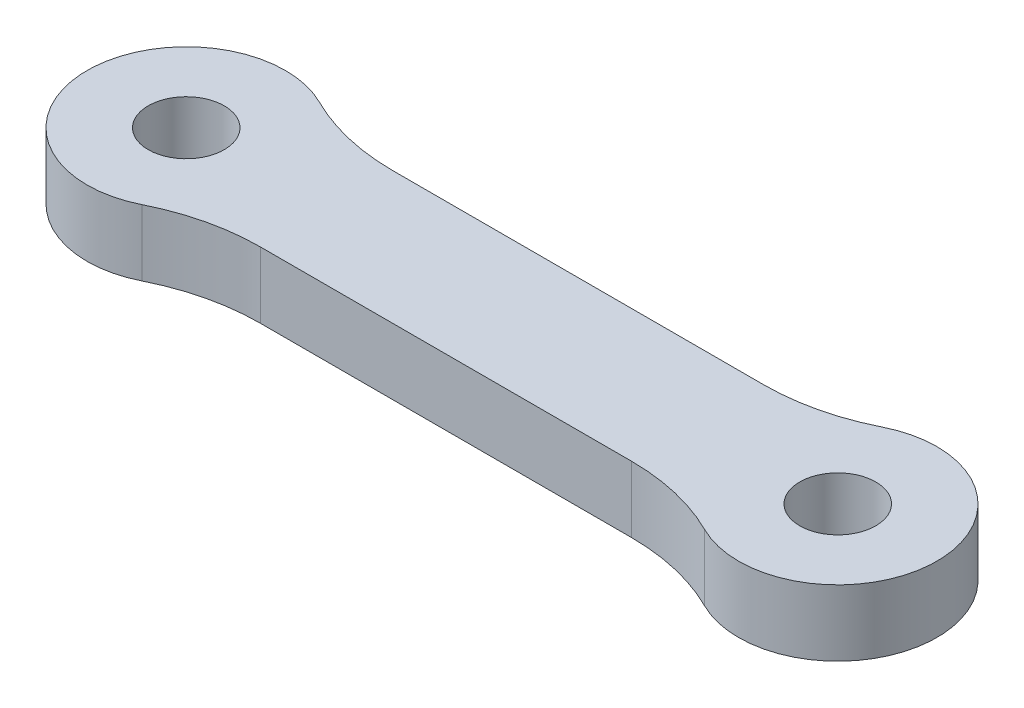
ISO-10303-21;
HEADER;
FILE_DESCRIPTION(('STEP AP214'),'2;1');
FILE_NAME('part.step','',(''),(''),'','','');
FILE_SCHEMA(('AUTOMOTIVE_DESIGN { 1 0 10303 214 1 1 1 1 }'));
ENDSEC;
DATA;
#1=APPLICATION_CONTEXT('core data for automotive mechanical design processes');
#2=APPLICATION_PROTOCOL_DEFINITION('international standard','automotive_design',2000,#1);
#3=PRODUCT_CONTEXT('',#1,'mechanical');
#4=PRODUCT('Part','Part','',(#3));
#5=PRODUCT_RELATED_PRODUCT_CATEGORY('part','',(#4));
#6=PRODUCT_DEFINITION_FORMATION('','',#4);
#7=PRODUCT_DEFINITION_CONTEXT('part definition',#1,'design');
#8=PRODUCT_DEFINITION('design','',#6,#7);
#9=PRODUCT_DEFINITION_SHAPE('','',#8);
#10=(LENGTH_UNIT() NAMED_UNIT(*) SI_UNIT(.MILLI.,.METRE.));
#11=(NAMED_UNIT(*) PLANE_ANGLE_UNIT() SI_UNIT($,.RADIAN.));
#12=(NAMED_UNIT(*) SI_UNIT($,.STERADIAN.) SOLID_ANGLE_UNIT());
#13=UNCERTAINTY_MEASURE_WITH_UNIT(LENGTH_MEASURE(1.E-05),#10,'distance_accuracy_value','');
#14=(GEOMETRIC_REPRESENTATION_CONTEXT(3) GLOBAL_UNCERTAINTY_ASSIGNED_CONTEXT((#13)) GLOBAL_UNIT_ASSIGNED_CONTEXT((#10,
#11,#12)) REPRESENTATION_CONTEXT('',''));
#15=CARTESIAN_POINT('',(0.,0.,0.));
#16=DIRECTION('',(0.,0.,1.));
#17=DIRECTION('',(1.,0.,0.));
#18=AXIS2_PLACEMENT_3D('',#15,#16,#17);
#19=CARTESIAN_POINT('',(0.,2.,2.));
#20=DIRECTION('',(0.,0.,1.));
#21=DIRECTION('',(1.,0.,0.));
#22=AXIS2_PLACEMENT_3D('',#19,#20,#21);
#23=PLANE('',#22);
#24=DIRECTION('',(-1.,0.,0.));
#25=VECTOR('',#24,1.);
#26=CARTESIAN_POINT('',(0.,0.,2.));
#27=LINE('',#26,#25);
#28=CARTESIAN_POINT('',(15.4573593128807,0.,2.));
#29=VERTEX_POINT('',#28);
#30=CARTESIAN_POINT('',(4.24264068711928,0.,2.));
#31=VERTEX_POINT('',#30);
#32=EDGE_CURVE('E171',#29,#31,#27,.T.);
#33=ORIENTED_EDGE('',*,*,#32,.F.);
#34=DIRECTION('',(0.,-1.,0.));
#35=VECTOR('',#34,1.);
#36=CARTESIAN_POINT('',(15.4573593128807,2.,2.));
#37=LINE('',#36,#35);
#38=CARTESIAN_POINT('',(15.4573593128807,2.,2.));
#39=VERTEX_POINT('',#38);
#40=EDGE_CURVE('E140',#29,#39,#37,.F.);
#41=ORIENTED_EDGE('',*,*,#40,.T.);
#42=DIRECTION('',(-1.,0.,0.));
#43=VECTOR('',#42,1.);
#44=CARTESIAN_POINT('',(0.,2.,2.));
#45=LINE('',#44,#43);
#46=CARTESIAN_POINT('',(4.24264068711928,2.,2.));
#47=VERTEX_POINT('',#46);
#48=EDGE_CURVE('E159',#39,#47,#45,.T.);
#49=ORIENTED_EDGE('',*,*,#48,.T.);
#50=DIRECTION('',(0.,-1.,0.));
#51=VECTOR('',#50,1.);
#52=CARTESIAN_POINT('',(4.24264068711928,2.,2.));
#53=LINE('',#52,#51);
#54=EDGE_CURVE('E137',#47,#31,#53,.T.);
#55=ORIENTED_EDGE('',*,*,#54,.T.);
#56=EDGE_LOOP('',(#33,#41,#49,#55));
#57=FACE_BOUND('',#56,.T.);
#58=ADVANCED_FACE('F41',(#57),#23,.T.);
#59=CARTESIAN_POINT('',(19.7,2.,0.));
#60=DIRECTION('',(0.,-1.,0.));
#61=DIRECTION('',(0.,0.,-1.));
#62=AXIS2_PLACEMENT_3D('',#59,#60,#61);
#63=CYLINDRICAL_SURFACE('',#62,3.);
#64=CARTESIAN_POINT('',(19.7,0.,0.));
#65=DIRECTION('',(0.,1.,0.));
#66=DIRECTION('',(0.,0.,1.));
#67=AXIS2_PLACEMENT_3D('',#64,#65,#66);
#68=CIRCLE('',#67,3.);
#69=CARTESIAN_POINT('',(18.3602187303834,0.,2.68421052631579));
#70=VERTEX_POINT('',#69);
#71=CARTESIAN_POINT('',(18.3602187303834,0.,-2.68421052631579));
#72=VERTEX_POINT('',#71);
#73=EDGE_CURVE('E123',#70,#72,#68,.T.);
#74=ORIENTED_EDGE('',*,*,#73,.T.);
#75=DIRECTION('',(0.,-1.,0.));
#76=VECTOR('',#75,1.);
#77=CARTESIAN_POINT('',(18.3602187303834,2.,-2.68421052631579));
#78=LINE('',#77,#76);
#79=CARTESIAN_POINT('',(18.3602187303834,2.,-2.68421052631579));
#80=VERTEX_POINT('',#79);
#81=EDGE_CURVE('E135',#72,#80,#78,.F.);
#82=ORIENTED_EDGE('',*,*,#81,.T.);
#83=CARTESIAN_POINT('',(19.7,2.,0.));
#84=DIRECTION('',(0.,1.,0.));
#85=DIRECTION('',(0.,0.,1.));
#86=AXIS2_PLACEMENT_3D('',#83,#84,#85);
#87=CIRCLE('',#86,3.);
#88=CARTESIAN_POINT('',(18.3602187303834,2.,2.68421052631579));
#89=VERTEX_POINT('',#88);
#90=EDGE_CURVE('E167',#89,#80,#87,.T.);
#91=ORIENTED_EDGE('',*,*,#90,.F.);
#92=DIRECTION('',(0.,-1.,0.));
#93=VECTOR('',#92,1.);
#94=CARTESIAN_POINT('',(18.3602187303834,2.,2.68421052631579));
#95=LINE('',#94,#93);
#96=EDGE_CURVE('E127',#89,#70,#95,.T.);
#97=ORIENTED_EDGE('',*,*,#96,.T.);
#98=EDGE_LOOP('',(#74,#82,#91,#97));
#99=FACE_BOUND('',#98,.T.);
#100=ADVANCED_FACE('F194',(#99),#63,.T.);
#101=CARTESIAN_POINT('',(0.,2.,-2.));
#102=DIRECTION('',(0.,0.,-1.));
#103=DIRECTION('',(-1.,0.,0.));
#104=AXIS2_PLACEMENT_3D('',#101,#102,#103);
#105=PLANE('',#104);
#106=DIRECTION('',(1.,0.,0.));
#107=VECTOR('',#106,1.);
#108=CARTESIAN_POINT('',(0.,2.,-2.));
#109=LINE('',#108,#107);
#110=CARTESIAN_POINT('',(4.24264068711928,2.,-2.));
#111=VERTEX_POINT('',#110);
#112=CARTESIAN_POINT('',(15.4573593128807,2.,-2.));
#113=VERTEX_POINT('',#112);
#114=EDGE_CURVE('E129',#111,#113,#109,.T.);
#115=ORIENTED_EDGE('',*,*,#114,.T.);
#116=DIRECTION('',(0.,-1.,0.));
#117=VECTOR('',#116,1.);
#118=CARTESIAN_POINT('',(15.4573593128807,2.,-2.));
#119=LINE('',#118,#117);
#120=CARTESIAN_POINT('',(15.4573593128807,0.,-2.));
#121=VERTEX_POINT('',#120);
#122=EDGE_CURVE('E122',#113,#121,#119,.T.);
#123=ORIENTED_EDGE('',*,*,#122,.T.);
#124=DIRECTION('',(1.,0.,0.));
#125=VECTOR('',#124,1.);
#126=CARTESIAN_POINT('',(0.,0.,-2.));
#127=LINE('',#126,#125);
#128=CARTESIAN_POINT('',(4.24264068711928,0.,-2.));
#129=VERTEX_POINT('',#128);
#130=EDGE_CURVE('E109',#129,#121,#127,.T.);
#131=ORIENTED_EDGE('',*,*,#130,.F.);
#132=DIRECTION('',(0.,-1.,0.));
#133=VECTOR('',#132,1.);
#134=CARTESIAN_POINT('',(4.24264068711928,2.,-2.));
#135=LINE('',#134,#133);
#136=EDGE_CURVE('E120',#129,#111,#135,.F.);
#137=ORIENTED_EDGE('',*,*,#136,.T.);
#138=EDGE_LOOP('',(#115,#123,#131,#137));
#139=FACE_BOUND('',#138,.T.);
#140=ADVANCED_FACE('F119',(#139),#105,.T.);
#141=CARTESIAN_POINT('',(0.,2.,0.));
#142=DIRECTION('',(0.,-1.,0.));
#143=DIRECTION('',(0.,0.,-1.));
#144=AXIS2_PLACEMENT_3D('',#141,#142,#143);
#145=CYLINDRICAL_SURFACE('',#144,1.15);
#146=CARTESIAN_POINT('',(0.,2.,0.));
#147=DIRECTION('',(0.,1.,0.));
#148=DIRECTION('',(0.,0.,1.));
#149=AXIS2_PLACEMENT_3D('',#146,#147,#148);
#150=CIRCLE('',#149,1.15);
#151=CARTESIAN_POINT('',(0.,2.,1.15));
#152=VERTEX_POINT('',#151);
#153=EDGE_CURVE('E168',#152,#152,#150,.T.);
#154=ORIENTED_EDGE('',*,*,#153,.T.);
#155=EDGE_LOOP('',(#154));
#156=FACE_BOUND('',#155,.T.);
#157=CARTESIAN_POINT('',(0.,0.,0.));
#158=DIRECTION('',(0.,1.,0.));
#159=DIRECTION('',(0.,0.,1.));
#160=AXIS2_PLACEMENT_3D('',#157,#158,#159);
#161=CIRCLE('',#160,1.15);
#162=CARTESIAN_POINT('',(0.,0.,1.15));
#163=VERTEX_POINT('',#162);
#164=EDGE_CURVE('E187',#163,#163,#161,.T.);
#165=ORIENTED_EDGE('',*,*,#164,.F.);
#166=EDGE_LOOP('',(#165));
#167=FACE_BOUND('',#166,.T.);
#168=ADVANCED_FACE('F218',(#156,#167),#145,.F.);
#169=CARTESIAN_POINT('',(19.7,2.,0.));
#170=DIRECTION('',(0.,-1.,0.));
#171=DIRECTION('',(0.,0.,-1.));
#172=AXIS2_PLACEMENT_3D('',#169,#170,#171);
#173=CYLINDRICAL_SURFACE('',#172,1.15);
#174=CARTESIAN_POINT('',(19.7,2.,0.));
#175=DIRECTION('',(0.,1.,0.));
#176=DIRECTION('',(0.,0.,1.));
#177=AXIS2_PLACEMENT_3D('',#174,#175,#176);
#178=CIRCLE('',#177,1.15);
#179=CARTESIAN_POINT('',(19.7,2.,1.15));
#180=VERTEX_POINT('',#179);
#181=EDGE_CURVE('E173',#180,#180,#178,.T.);
#182=ORIENTED_EDGE('',*,*,#181,.T.);
#183=EDGE_LOOP('',(#182));
#184=FACE_BOUND('',#183,.T.);
#185=CARTESIAN_POINT('',(19.7,0.,0.));
#186=DIRECTION('',(0.,1.,0.));
#187=DIRECTION('',(0.,0.,1.));
#188=AXIS2_PLACEMENT_3D('',#185,#186,#187);
#189=CIRCLE('',#188,1.15);
#190=CARTESIAN_POINT('',(19.7,0.,1.15));
#191=VERTEX_POINT('',#190);
#192=EDGE_CURVE('E184',#191,#191,#189,.T.);
#193=ORIENTED_EDGE('',*,*,#192,.F.);
#194=EDGE_LOOP('',(#193));
#195=FACE_BOUND('',#194,.T.);
#196=ADVANCED_FACE('F221',(#184,#195),#173,.F.);
#197=CARTESIAN_POINT('',(0.,2.,0.));
#198=DIRECTION('',(0.,-1.,0.));
#199=DIRECTION('',(0.,0.,-1.));
#200=AXIS2_PLACEMENT_3D('',#197,#198,#199);
#201=CYLINDRICAL_SURFACE('',#200,3.);
#202=CARTESIAN_POINT('',(0.,0.,0.));
#203=DIRECTION('',(0.,1.,0.));
#204=DIRECTION('',(0.,0.,1.));
#205=AXIS2_PLACEMENT_3D('',#202,#203,#204);
#206=CIRCLE('',#205,3.);
#207=CARTESIAN_POINT('',(1.33978126961662,0.,-2.68421052631579));
#208=VERTEX_POINT('',#207);
#209=CARTESIAN_POINT('',(1.33978126961661,0.,2.68421052631579));
#210=VERTEX_POINT('',#209);
#211=EDGE_CURVE('E110',#208,#210,#206,.T.);
#212=ORIENTED_EDGE('',*,*,#211,.T.);
#213=DIRECTION('',(0.,-1.,0.));
#214=VECTOR('',#213,1.);
#215=CARTESIAN_POINT('',(1.33978126961661,2.,2.68421052631579));
#216=LINE('',#215,#214);
#217=CARTESIAN_POINT('',(1.33978126961661,2.,2.68421052631579));
#218=VERTEX_POINT('',#217);
#219=EDGE_CURVE('E56',#210,#218,#216,.F.);
#220=ORIENTED_EDGE('',*,*,#219,.T.);
#221=CARTESIAN_POINT('',(0.,2.,0.));
#222=DIRECTION('',(0.,1.,0.));
#223=DIRECTION('',(0.,0.,1.));
#224=AXIS2_PLACEMENT_3D('',#221,#222,#223);
#225=CIRCLE('',#224,3.);
#226=CARTESIAN_POINT('',(1.33978126961662,2.,-2.68421052631579));
#227=VERTEX_POINT('',#226);
#228=EDGE_CURVE('E125',#227,#218,#225,.T.);
#229=ORIENTED_EDGE('',*,*,#228,.F.);
#230=DIRECTION('',(0.,-1.,0.));
#231=VECTOR('',#230,1.);
#232=CARTESIAN_POINT('',(1.33978126961662,2.,-2.68421052631579));
#233=LINE('',#232,#231);
#234=EDGE_CURVE('E142',#227,#208,#233,.T.);
#235=ORIENTED_EDGE('',*,*,#234,.T.);
#236=EDGE_LOOP('',(#212,#220,#229,#235));
#237=FACE_BOUND('',#236,.T.);
#238=ADVANCED_FACE('F172',(#237),#201,.T.);
#239=CARTESIAN_POINT('',(0.,2.,0.));
#240=DIRECTION('',(0.,1.,0.));
#241=DIRECTION('',(0.,0.,1.));
#242=AXIS2_PLACEMENT_3D('',#239,#240,#241);
#243=PLANE('',#242);
#244=ORIENTED_EDGE('',*,*,#181,.F.);
#245=EDGE_LOOP('',(#244));
#246=FACE_BOUND('',#245,.T.);
#247=ORIENTED_EDGE('',*,*,#153,.F.);
#248=EDGE_LOOP('',(#247));
#249=FACE_BOUND('',#248,.T.);
#250=ORIENTED_EDGE('',*,*,#48,.F.);
#251=CARTESIAN_POINT('',(15.4573593128807,2.,8.5));
#252=DIRECTION('',(0.,1.,0.));
#253=DIRECTION('',(0.,0.,1.));
#254=AXIS2_PLACEMENT_3D('',#251,#252,#253);
#255=CIRCLE('',#254,6.5);
#256=EDGE_CURVE('E151',#39,#89,#255,.F.);
#257=ORIENTED_EDGE('',*,*,#256,.T.);
#258=ORIENTED_EDGE('',*,*,#90,.T.);
#259=CARTESIAN_POINT('',(15.4573593128807,2.,-8.5));
#260=DIRECTION('',(0.,1.,0.));
#261=DIRECTION('',(0.,0.,1.));
#262=AXIS2_PLACEMENT_3D('',#259,#260,#261);
#263=CIRCLE('',#262,6.5);
#264=EDGE_CURVE('E147',#80,#113,#263,.F.);
#265=ORIENTED_EDGE('',*,*,#264,.T.);
#266=ORIENTED_EDGE('',*,*,#114,.F.);
#267=CARTESIAN_POINT('',(4.24264068711928,2.,-8.5));
#268=DIRECTION('',(0.,1.,0.));
#269=DIRECTION('',(0.,0.,1.));
#270=AXIS2_PLACEMENT_3D('',#267,#268,#269);
#271=CIRCLE('',#270,6.5);
#272=EDGE_CURVE('E11',#111,#227,#271,.F.);
#273=ORIENTED_EDGE('',*,*,#272,.T.);
#274=ORIENTED_EDGE('',*,*,#228,.T.);
#275=CARTESIAN_POINT('',(4.24264068711928,2.,8.5));
#276=DIRECTION('',(0.,1.,0.));
#277=DIRECTION('',(0.,0.,1.));
#278=AXIS2_PLACEMENT_3D('',#275,#276,#277);
#279=CIRCLE('',#278,6.5);
#280=EDGE_CURVE('E115',#218,#47,#279,.F.);
#281=ORIENTED_EDGE('',*,*,#280,.T.);
#282=EDGE_LOOP('',(#250,#257,#258,#265,#266,#273,#274,#281));
#283=FACE_BOUND('',#282,.T.);
#284=ADVANCED_FACE('F158',(#246,#249,#283),#243,.T.);
#285=CARTESIAN_POINT('',(0.,0.,0.));
#286=DIRECTION('',(0.,1.,0.));
#287=DIRECTION('',(0.,0.,1.));
#288=AXIS2_PLACEMENT_3D('',#285,#286,#287);
#289=PLANE('',#288);
#290=ORIENTED_EDGE('',*,*,#192,.T.);
#291=EDGE_LOOP('',(#290));
#292=FACE_BOUND('',#291,.T.);
#293=ORIENTED_EDGE('',*,*,#164,.T.);
#294=EDGE_LOOP('',(#293));
#295=FACE_BOUND('',#294,.T.);
#296=ORIENTED_EDGE('',*,*,#73,.F.);
#297=CARTESIAN_POINT('',(15.4573593128807,0.,8.5));
#298=DIRECTION('',(0.,1.,0.));
#299=DIRECTION('',(0.,0.,1.));
#300=AXIS2_PLACEMENT_3D('',#297,#298,#299);
#301=CIRCLE('',#300,6.5);
#302=EDGE_CURVE('E149',#70,#29,#301,.T.);
#303=ORIENTED_EDGE('',*,*,#302,.T.);
#304=ORIENTED_EDGE('',*,*,#32,.T.);
#305=CARTESIAN_POINT('',(4.24264068711928,0.,8.5));
#306=DIRECTION('',(0.,1.,0.));
#307=DIRECTION('',(0.,0.,1.));
#308=AXIS2_PLACEMENT_3D('',#305,#306,#307);
#309=CIRCLE('',#308,6.5);
#310=EDGE_CURVE('E153',#31,#210,#309,.T.);
#311=ORIENTED_EDGE('',*,*,#310,.T.);
#312=ORIENTED_EDGE('',*,*,#211,.F.);
#313=CARTESIAN_POINT('',(4.24264068711928,0.,-8.5));
#314=DIRECTION('',(0.,1.,0.));
#315=DIRECTION('',(0.,0.,1.));
#316=AXIS2_PLACEMENT_3D('',#313,#314,#315);
#317=CIRCLE('',#316,6.5);
#318=EDGE_CURVE('E49',#208,#129,#317,.T.);
#319=ORIENTED_EDGE('',*,*,#318,.T.);
#320=ORIENTED_EDGE('',*,*,#130,.T.);
#321=CARTESIAN_POINT('',(15.4573593128807,0.,-8.5));
#322=DIRECTION('',(0.,1.,0.));
#323=DIRECTION('',(0.,0.,1.));
#324=AXIS2_PLACEMENT_3D('',#321,#322,#323);
#325=CIRCLE('',#324,6.5);
#326=EDGE_CURVE('E145',#121,#72,#325,.T.);
#327=ORIENTED_EDGE('',*,*,#326,.T.);
#328=EDGE_LOOP('',(#296,#303,#304,#311,#312,#319,#320,#327));
#329=FACE_BOUND('',#328,.T.);
#330=ADVANCED_FACE('F108',(#292,#295,#329),#289,.F.);
#331=CARTESIAN_POINT('',(15.4573593128807,2.,-8.5));
#332=DIRECTION('',(0.,-1.,0.));
#333=DIRECTION('',(0.,0.,-1.));
#334=AXIS2_PLACEMENT_3D('',#331,#332,#333);
#335=CYLINDRICAL_SURFACE('',#334,6.5);
#336=ORIENTED_EDGE('',*,*,#264,.F.);
#337=ORIENTED_EDGE('',*,*,#81,.F.);
#338=ORIENTED_EDGE('',*,*,#326,.F.);
#339=ORIENTED_EDGE('',*,*,#122,.F.);
#340=EDGE_LOOP('',(#336,#337,#338,#339));
#341=FACE_BOUND('',#340,.T.);
#342=ADVANCED_FACE('F199',(#341),#335,.F.);
#343=CARTESIAN_POINT('',(15.4573593128807,2.,8.5));
#344=DIRECTION('',(0.,-1.,0.));
#345=DIRECTION('',(0.,0.,-1.));
#346=AXIS2_PLACEMENT_3D('',#343,#344,#345);
#347=CYLINDRICAL_SURFACE('',#346,6.5);
#348=ORIENTED_EDGE('',*,*,#256,.F.);
#349=ORIENTED_EDGE('',*,*,#40,.F.);
#350=ORIENTED_EDGE('',*,*,#302,.F.);
#351=ORIENTED_EDGE('',*,*,#96,.F.);
#352=EDGE_LOOP('',(#348,#349,#350,#351));
#353=FACE_BOUND('',#352,.T.);
#354=ADVANCED_FACE('F201',(#353),#347,.F.);
#355=CARTESIAN_POINT('',(4.24264068711928,2.,8.5));
#356=DIRECTION('',(0.,-1.,0.));
#357=DIRECTION('',(0.,0.,-1.));
#358=AXIS2_PLACEMENT_3D('',#355,#356,#357);
#359=CYLINDRICAL_SURFACE('',#358,6.5);
#360=ORIENTED_EDGE('',*,*,#280,.F.);
#361=ORIENTED_EDGE('',*,*,#219,.F.);
#362=ORIENTED_EDGE('',*,*,#310,.F.);
#363=ORIENTED_EDGE('',*,*,#54,.F.);
#364=EDGE_LOOP('',(#360,#361,#362,#363));
#365=FACE_BOUND('',#364,.T.);
#366=ADVANCED_FACE('F170',(#365),#359,.F.);
#367=CARTESIAN_POINT('',(4.24264068711928,2.,-8.5));
#368=DIRECTION('',(0.,-1.,0.));
#369=DIRECTION('',(0.,0.,-1.));
#370=AXIS2_PLACEMENT_3D('',#367,#368,#369);
#371=CYLINDRICAL_SURFACE('',#370,6.5);
#372=ORIENTED_EDGE('',*,*,#272,.F.);
#373=ORIENTED_EDGE('',*,*,#136,.F.);
#374=ORIENTED_EDGE('',*,*,#318,.F.);
#375=ORIENTED_EDGE('',*,*,#234,.F.);
#376=EDGE_LOOP('',(#372,#373,#374,#375));
#377=FACE_BOUND('',#376,.T.);
#378=ADVANCED_FACE('F43',(#377),#371,.F.);
#379=CLOSED_SHELL('',(#58,#100,#140,#168,#196,#238,#284,#330,#342,#354,#366,#378));
#380=MANIFOLD_SOLID_BREP('B2',#379);
#381=ADVANCED_BREP_SHAPE_REPRESENTATION('',(#18,#380),#14);
#382=SHAPE_DEFINITION_REPRESENTATION(#9,#381);
ENDSEC;
END-ISO-10303-21;
